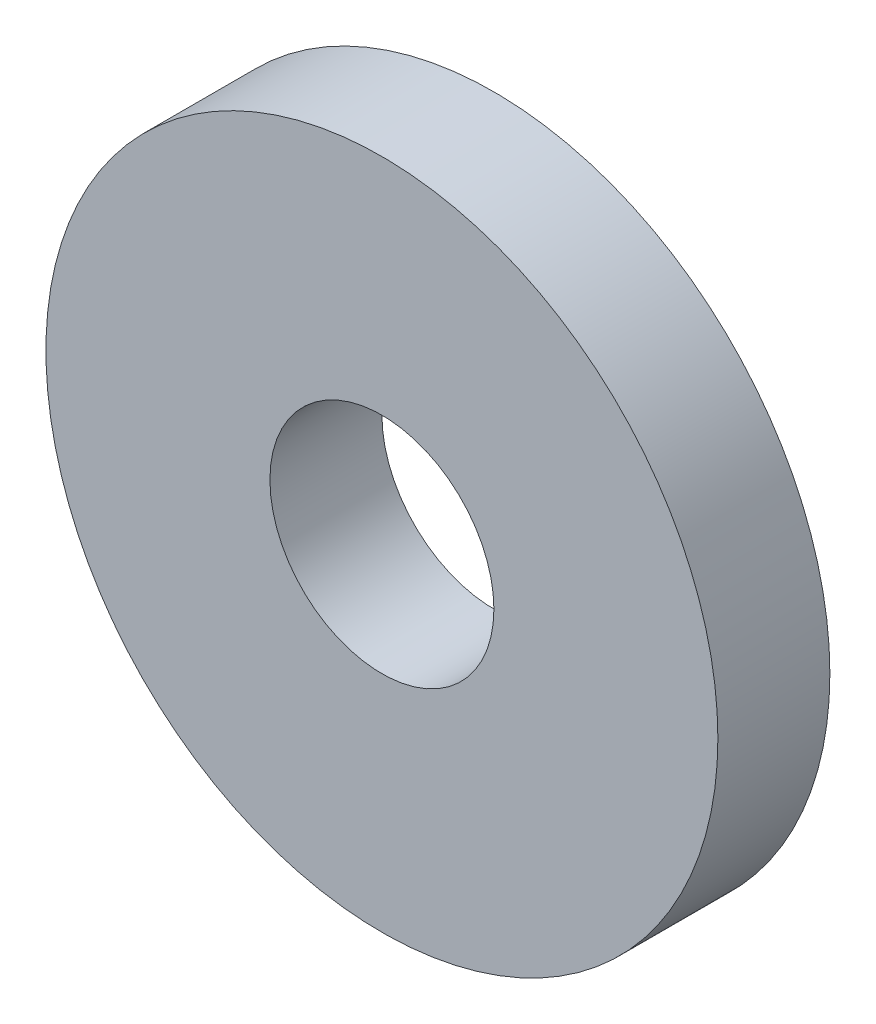
ISO-10303-21;
HEADER;
FILE_DESCRIPTION(('STEP AP214'),'2;1');
FILE_NAME('part.step','',(''),(''),'','','');
FILE_SCHEMA(('AUTOMOTIVE_DESIGN { 1 0 10303 214 1 1 1 1 }'));
ENDSEC;
DATA;
#1=APPLICATION_CONTEXT('core data for automotive mechanical design processes');
#2=APPLICATION_PROTOCOL_DEFINITION('international standard','automotive_design',2000,#1);
#3=PRODUCT_CONTEXT('',#1,'mechanical');
#4=PRODUCT('Part','Part','',(#3));
#5=PRODUCT_RELATED_PRODUCT_CATEGORY('part','',(#4));
#6=PRODUCT_DEFINITION_FORMATION('','',#4);
#7=PRODUCT_DEFINITION_CONTEXT('part definition',#1,'design');
#8=PRODUCT_DEFINITION('design','',#6,#7);
#9=PRODUCT_DEFINITION_SHAPE('','',#8);
#10=(LENGTH_UNIT() NAMED_UNIT(*) SI_UNIT(.MILLI.,.METRE.));
#11=(NAMED_UNIT(*) PLANE_ANGLE_UNIT() SI_UNIT($,.RADIAN.));
#12=(NAMED_UNIT(*) SI_UNIT($,.STERADIAN.) SOLID_ANGLE_UNIT());
#13=UNCERTAINTY_MEASURE_WITH_UNIT(LENGTH_MEASURE(1.E-05),#10,'distance_accuracy_value','');
#14=(GEOMETRIC_REPRESENTATION_CONTEXT(3) GLOBAL_UNCERTAINTY_ASSIGNED_CONTEXT((#13)) GLOBAL_UNIT_ASSIGNED_CONTEXT((#10,
#11,#12)) REPRESENTATION_CONTEXT('',''));
#15=CARTESIAN_POINT('',(0.,0.,0.));
#16=DIRECTION('',(0.,0.,1.));
#17=DIRECTION('',(1.,0.,0.));
#18=AXIS2_PLACEMENT_3D('',#15,#16,#17);
#19=CARTESIAN_POINT('',(0.,0.,0.));
#20=DIRECTION('',(0.,0.,1.));
#21=DIRECTION('',(1.,0.,0.));
#22=AXIS2_PLACEMENT_3D('',#19,#20,#21);
#23=PLANE('',#22);
#24=CARTESIAN_POINT('',(0.,0.,0.));
#25=DIRECTION('',(0.,0.,1.));
#26=DIRECTION('',(1.,0.,0.));
#27=AXIS2_PLACEMENT_3D('',#24,#25,#26);
#28=CIRCLE('',#27,3.);
#29=CARTESIAN_POINT('',(3.,0.,0.));
#30=VERTEX_POINT('',#29);
#31=EDGE_CURVE('E39',#30,#30,#28,.T.);
#32=ORIENTED_EDGE('',*,*,#31,.F.);
#33=EDGE_LOOP('',(#32));
#34=FACE_BOUND('',#33,.T.);
#35=CARTESIAN_POINT('',(0.,0.,0.));
#36=DIRECTION('',(0.,0.,1.));
#37=DIRECTION('',(1.,0.,0.));
#38=AXIS2_PLACEMENT_3D('',#35,#36,#37);
#39=CIRCLE('',#38,2.5);
#40=CARTESIAN_POINT('',(2.5,0.,0.));
#41=VERTEX_POINT('',#40);
#42=EDGE_CURVE('E46',#41,#41,#39,.T.);
#43=ORIENTED_EDGE('',*,*,#42,.T.);
#44=EDGE_LOOP('',(#43));
#45=FACE_BOUND('',#44,.T.);
#46=ADVANCED_FACE('F35',(#34,#45),#23,.F.);
#47=CARTESIAN_POINT('',(0.,0.,1.));
#48=DIRECTION('',(0.,0.,-1.));
#49=DIRECTION('',(-1.,0.,0.));
#50=AXIS2_PLACEMENT_3D('',#47,#48,#49);
#51=CYLINDRICAL_SURFACE('',#50,3.);
#52=CARTESIAN_POINT('',(0.,0.,1.));
#53=DIRECTION('',(0.,0.,1.));
#54=DIRECTION('',(1.,0.,0.));
#55=AXIS2_PLACEMENT_3D('',#52,#53,#54);
#56=CIRCLE('',#55,3.);
#57=CARTESIAN_POINT('',(3.,0.,1.));
#58=VERTEX_POINT('',#57);
#59=EDGE_CURVE('E10',#58,#58,#56,.T.);
#60=ORIENTED_EDGE('',*,*,#59,.F.);
#61=EDGE_LOOP('',(#60));
#62=FACE_BOUND('',#61,.T.);
#63=ORIENTED_EDGE('',*,*,#31,.T.);
#64=EDGE_LOOP('',(#63));
#65=FACE_BOUND('',#64,.T.);
#66=ADVANCED_FACE('F37',(#62,#65),#51,.T.);
#67=CARTESIAN_POINT('',(0.,0.,1.));
#68=DIRECTION('',(0.,0.,1.));
#69=DIRECTION('',(1.,0.,0.));
#70=AXIS2_PLACEMENT_3D('',#67,#68,#69);
#71=PLANE('',#70);
#72=CARTESIAN_POINT('',(0.,0.,1.));
#73=DIRECTION('',(0.,0.,-1.));
#74=DIRECTION('',(-1.,0.,0.));
#75=AXIS2_PLACEMENT_3D('',#72,#73,#74);
#76=CIRCLE('',#75,1.);
#77=CARTESIAN_POINT('',(-1.,0.,1.));
#78=VERTEX_POINT('',#77);
#79=EDGE_CURVE('E53',#78,#78,#76,.T.);
#80=ORIENTED_EDGE('',*,*,#79,.T.);
#81=EDGE_LOOP('',(#80));
#82=FACE_BOUND('',#81,.T.);
#83=ORIENTED_EDGE('',*,*,#59,.T.);
#84=EDGE_LOOP('',(#83));
#85=FACE_BOUND('',#84,.T.);
#86=ADVANCED_FACE('F60',(#82,#85),#71,.T.);
#87=CARTESIAN_POINT('',(0.,0.,0.));
#88=DIRECTION('',(0.,0.,1.));
#89=DIRECTION('',(1.,0.,0.));
#90=AXIS2_PLACEMENT_3D('',#87,#88,#89);
#91=TOROIDAL_SURFACE('',#90,2.,0.5);
#92=ORIENTED_EDGE('',*,*,#42,.F.);
#93=EDGE_LOOP('',(#92));
#94=FACE_BOUND('',#93,.T.);
#95=CARTESIAN_POINT('',(0.,0.,0.));
#96=DIRECTION('',(0.,0.,1.));
#97=DIRECTION('',(1.,0.,0.));
#98=AXIS2_PLACEMENT_3D('',#95,#96,#97);
#99=CIRCLE('',#98,1.5);
#100=CARTESIAN_POINT('',(1.5,0.,0.));
#101=VERTEX_POINT('',#100);
#102=EDGE_CURVE('E50',#101,#101,#99,.T.);
#103=ORIENTED_EDGE('',*,*,#102,.T.);
#104=EDGE_LOOP('',(#103));
#105=FACE_BOUND('',#104,.T.);
#106=ADVANCED_FACE('F71',(#94,#105),#91,.F.);
#107=CARTESIAN_POINT('',(0.,0.,0.));
#108=DIRECTION('',(0.,0.,-1.));
#109=DIRECTION('',(-1.,0.,0.));
#110=AXIS2_PLACEMENT_3D('',#107,#108,#109);
#111=CIRCLE('',#110,1.);
#112=CARTESIAN_POINT('',(-1.,0.,0.));
#113=VERTEX_POINT('',#112);
#114=EDGE_CURVE('E54',#113,#113,#111,.T.);
#115=ORIENTED_EDGE('',*,*,#114,.F.);
#116=EDGE_LOOP('',(#115));
#117=FACE_BOUND('',#116,.T.);
#118=ORIENTED_EDGE('',*,*,#102,.F.);
#119=EDGE_LOOP('',(#118));
#120=FACE_BOUND('',#119,.T.);
#121=ADVANCED_FACE('F65',(#117,#120),#23,.F.);
#122=CARTESIAN_POINT('',(0.,0.,1.));
#123=DIRECTION('',(0.,0.,-1.));
#124=DIRECTION('',(-1.,0.,0.));
#125=AXIS2_PLACEMENT_3D('',#122,#123,#124);
#126=CYLINDRICAL_SURFACE('',#125,1.);
#127=ORIENTED_EDGE('',*,*,#79,.F.);
#128=EDGE_LOOP('',(#127));
#129=FACE_BOUND('',#128,.T.);
#130=ORIENTED_EDGE('',*,*,#114,.T.);
#131=EDGE_LOOP('',(#130));
#132=FACE_BOUND('',#131,.T.);
#133=ADVANCED_FACE('F62',(#129,#132),#126,.F.);
#134=CLOSED_SHELL('',(#46,#66,#86,#106,#121,#133));
#135=MANIFOLD_SOLID_BREP('B2',#134);
#136=ADVANCED_BREP_SHAPE_REPRESENTATION('',(#18,#135),#14);
#137=SHAPE_DEFINITION_REPRESENTATION(#9,#136);
ENDSEC;
END-ISO-10303-21;
